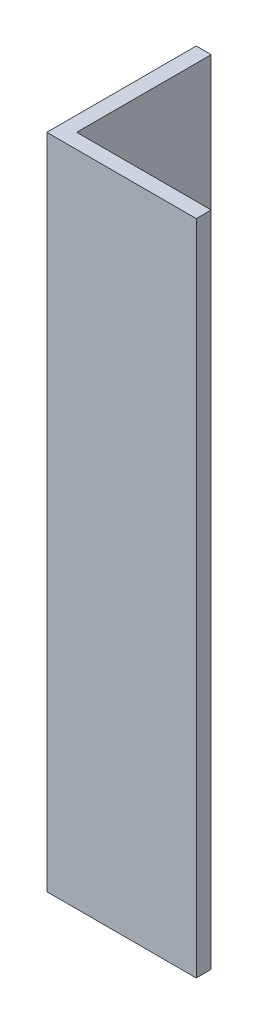
ISO-10303-21;
HEADER;
FILE_DESCRIPTION(('STEP AP214'),'2;1');
FILE_NAME('part.step','',(''),(''),'','','');
FILE_SCHEMA(('AUTOMOTIVE_DESIGN { 1 0 10303 214 1 1 1 1 }'));
ENDSEC;
DATA;
#1=APPLICATION_CONTEXT('core data for automotive mechanical design processes');
#2=APPLICATION_PROTOCOL_DEFINITION('international standard','automotive_design',2000,#1);
#3=PRODUCT_CONTEXT('',#1,'mechanical');
#4=PRODUCT('Part','Part','',(#3));
#5=PRODUCT_RELATED_PRODUCT_CATEGORY('part','',(#4));
#6=PRODUCT_DEFINITION_FORMATION('','',#4);
#7=PRODUCT_DEFINITION_CONTEXT('part definition',#1,'design');
#8=PRODUCT_DEFINITION('design','',#6,#7);
#9=PRODUCT_DEFINITION_SHAPE('','',#8);
#10=(LENGTH_UNIT() NAMED_UNIT(*) SI_UNIT(.MILLI.,.METRE.));
#11=(NAMED_UNIT(*) PLANE_ANGLE_UNIT() SI_UNIT($,.RADIAN.));
#12=(NAMED_UNIT(*) SI_UNIT($,.STERADIAN.) SOLID_ANGLE_UNIT());
#13=UNCERTAINTY_MEASURE_WITH_UNIT(LENGTH_MEASURE(1.E-05),#10,'distance_accuracy_value','');
#14=(GEOMETRIC_REPRESENTATION_CONTEXT(3) GLOBAL_UNCERTAINTY_ASSIGNED_CONTEXT((#13)) GLOBAL_UNIT_ASSIGNED_CONTEXT((#10,
#11,#12)) REPRESENTATION_CONTEXT('',''));
#15=CARTESIAN_POINT('',(0.,0.,0.));
#16=DIRECTION('',(0.,0.,1.));
#17=DIRECTION('',(1.,0.,0.));
#18=AXIS2_PLACEMENT_3D('',#15,#16,#17);
#19=CARTESIAN_POINT('',(0.,-44.,0.));
#20=DIRECTION('',(-1.,0.,0.));
#21=DIRECTION('',(0.,0.,1.));
#22=AXIS2_PLACEMENT_3D('',#19,#20,#21);
#23=PLANE('',#22);
#24=DIRECTION('',(0.,1.,0.));
#25=VECTOR('',#24,1.);
#26=CARTESIAN_POINT('',(0.,-44.,0.));
#27=LINE('',#26,#25);
#28=CARTESIAN_POINT('',(0.,-44.,0.));
#29=VERTEX_POINT('',#28);
#30=CARTESIAN_POINT('',(0.,44.,0.));
#31=VERTEX_POINT('',#30);
#32=EDGE_CURVE('E44',#29,#31,#27,.T.);
#33=ORIENTED_EDGE('',*,*,#32,.T.);
#34=DIRECTION('',(0.,0.,1.));
#35=VECTOR('',#34,1.);
#36=CARTESIAN_POINT('',(0.,44.,0.));
#37=LINE('',#36,#35);
#38=CARTESIAN_POINT('',(0.,44.,-20.));
#39=VERTEX_POINT('',#38);
#40=EDGE_CURVE('E94',#39,#31,#37,.T.);
#41=ORIENTED_EDGE('',*,*,#40,.F.);
#42=DIRECTION('',(0.,1.,0.));
#43=VECTOR('',#42,1.);
#44=CARTESIAN_POINT('',(0.,-44.,-20.));
#45=LINE('',#44,#43);
#46=CARTESIAN_POINT('',(0.,-44.,-20.));
#47=VERTEX_POINT('',#46);
#48=EDGE_CURVE('E11',#47,#39,#45,.T.);
#49=ORIENTED_EDGE('',*,*,#48,.F.);
#50=DIRECTION('',(0.,0.,1.));
#51=VECTOR('',#50,1.);
#52=CARTESIAN_POINT('',(0.,-44.,0.));
#53=LINE('',#52,#51);
#54=EDGE_CURVE('E95',#47,#29,#53,.T.);
#55=ORIENTED_EDGE('',*,*,#54,.T.);
#56=EDGE_LOOP('',(#33,#41,#49,#55));
#57=FACE_BOUND('',#56,.T.);
#58=ADVANCED_FACE('F41',(#57),#23,.T.);
#59=CARTESIAN_POINT('',(0.,-44.,-20.));
#60=DIRECTION('',(0.,0.,-1.));
#61=DIRECTION('',(-1.,0.,0.));
#62=AXIS2_PLACEMENT_3D('',#59,#60,#61);
#63=PLANE('',#62);
#64=ORIENTED_EDGE('',*,*,#48,.T.);
#65=DIRECTION('',(-1.,0.,0.));
#66=VECTOR('',#65,1.);
#67=CARTESIAN_POINT('',(0.,44.,-20.));
#68=LINE('',#67,#66);
#69=CARTESIAN_POINT('',(2.,44.,-20.));
#70=VERTEX_POINT('',#69);
#71=EDGE_CURVE('E114',#70,#39,#68,.T.);
#72=ORIENTED_EDGE('',*,*,#71,.F.);
#73=DIRECTION('',(0.,1.,0.));
#74=VECTOR('',#73,1.);
#75=CARTESIAN_POINT('',(2.,-44.,-20.));
#76=LINE('',#75,#74);
#77=CARTESIAN_POINT('',(2.,-44.,-20.));
#78=VERTEX_POINT('',#77);
#79=EDGE_CURVE('E50',#78,#70,#76,.T.);
#80=ORIENTED_EDGE('',*,*,#79,.F.);
#81=DIRECTION('',(-1.,0.,0.));
#82=VECTOR('',#81,1.);
#83=CARTESIAN_POINT('',(0.,-44.,-20.));
#84=LINE('',#83,#82);
#85=EDGE_CURVE('E101',#78,#47,#84,.T.);
#86=ORIENTED_EDGE('',*,*,#85,.T.);
#87=EDGE_LOOP('',(#64,#72,#80,#86));
#88=FACE_BOUND('',#87,.T.);
#89=ADVANCED_FACE('F169',(#88),#63,.T.);
#90=CARTESIAN_POINT('',(2.,-44.,-20.));
#91=DIRECTION('',(1.,0.,0.));
#92=DIRECTION('',(0.,0.,-1.));
#93=AXIS2_PLACEMENT_3D('',#90,#91,#92);
#94=PLANE('',#93);
#95=ORIENTED_EDGE('',*,*,#79,.T.);
#96=DIRECTION('',(0.,0.,-1.));
#97=VECTOR('',#96,1.);
#98=CARTESIAN_POINT('',(2.,44.,-20.));
#99=LINE('',#98,#97);
#100=CARTESIAN_POINT('',(2.,44.,-2.));
#101=VERTEX_POINT('',#100);
#102=EDGE_CURVE('E124',#101,#70,#99,.T.);
#103=ORIENTED_EDGE('',*,*,#102,.F.);
#104=DIRECTION('',(0.,1.,0.));
#105=VECTOR('',#104,1.);
#106=CARTESIAN_POINT('',(2.,-44.,-2.));
#107=LINE('',#106,#105);
#108=CARTESIAN_POINT('',(2.,-44.,-2.));
#109=VERTEX_POINT('',#108);
#110=EDGE_CURVE('E149',#109,#101,#107,.T.);
#111=ORIENTED_EDGE('',*,*,#110,.F.);
#112=DIRECTION('',(0.,0.,-1.));
#113=VECTOR('',#112,1.);
#114=CARTESIAN_POINT('',(2.,-44.,-20.));
#115=LINE('',#114,#113);
#116=EDGE_CURVE('E142',#109,#78,#115,.T.);
#117=ORIENTED_EDGE('',*,*,#116,.T.);
#118=EDGE_LOOP('',(#95,#103,#111,#117));
#119=FACE_BOUND('',#118,.T.);
#120=ADVANCED_FACE('F165',(#119),#94,.T.);
#121=CARTESIAN_POINT('',(20.,-44.,-2.));
#122=DIRECTION('',(0.,0.,-1.));
#123=DIRECTION('',(-1.,0.,0.));
#124=AXIS2_PLACEMENT_3D('',#121,#122,#123);
#125=PLANE('',#124);
#126=ORIENTED_EDGE('',*,*,#110,.T.);
#127=DIRECTION('',(-1.,0.,0.));
#128=VECTOR('',#127,1.);
#129=CARTESIAN_POINT('',(20.,44.,-2.));
#130=LINE('',#129,#128);
#131=CARTESIAN_POINT('',(20.,44.,-2.));
#132=VERTEX_POINT('',#131);
#133=EDGE_CURVE('E120',#132,#101,#130,.T.);
#134=ORIENTED_EDGE('',*,*,#133,.F.);
#135=DIRECTION('',(0.,1.,0.));
#136=VECTOR('',#135,1.);
#137=CARTESIAN_POINT('',(20.,-44.,-2.));
#138=LINE('',#137,#136);
#139=CARTESIAN_POINT('',(20.,-44.,-2.));
#140=VERTEX_POINT('',#139);
#141=EDGE_CURVE('E152',#140,#132,#138,.T.);
#142=ORIENTED_EDGE('',*,*,#141,.F.);
#143=DIRECTION('',(-1.,0.,0.));
#144=VECTOR('',#143,1.);
#145=CARTESIAN_POINT('',(20.,-44.,-2.));
#146=LINE('',#145,#144);
#147=EDGE_CURVE('E138',#140,#109,#146,.T.);
#148=ORIENTED_EDGE('',*,*,#147,.T.);
#149=EDGE_LOOP('',(#126,#134,#142,#148));
#150=FACE_BOUND('',#149,.T.);
#151=ADVANCED_FACE('F162',(#150),#125,.T.);
#152=CARTESIAN_POINT('',(20.,-44.,0.));
#153=DIRECTION('',(1.,0.,0.));
#154=DIRECTION('',(0.,0.,-1.));
#155=AXIS2_PLACEMENT_3D('',#152,#153,#154);
#156=PLANE('',#155);
#157=ORIENTED_EDGE('',*,*,#141,.T.);
#158=DIRECTION('',(0.,0.,-1.));
#159=VECTOR('',#158,1.);
#160=CARTESIAN_POINT('',(20.,44.,0.));
#161=LINE('',#160,#159);
#162=CARTESIAN_POINT('',(20.,44.,0.));
#163=VERTEX_POINT('',#162);
#164=EDGE_CURVE('E109',#163,#132,#161,.T.);
#165=ORIENTED_EDGE('',*,*,#164,.F.);
#166=DIRECTION('',(0.,1.,0.));
#167=VECTOR('',#166,1.);
#168=CARTESIAN_POINT('',(20.,-44.,0.));
#169=LINE('',#168,#167);
#170=CARTESIAN_POINT('',(20.,-44.,0.));
#171=VERTEX_POINT('',#170);
#172=EDGE_CURVE('E100',#171,#163,#169,.T.);
#173=ORIENTED_EDGE('',*,*,#172,.F.);
#174=DIRECTION('',(0.,0.,-1.));
#175=VECTOR('',#174,1.);
#176=CARTESIAN_POINT('',(20.,-44.,0.));
#177=LINE('',#176,#175);
#178=EDGE_CURVE('E134',#171,#140,#177,.T.);
#179=ORIENTED_EDGE('',*,*,#178,.T.);
#180=EDGE_LOOP('',(#157,#165,#173,#179));
#181=FACE_BOUND('',#180,.T.);
#182=ADVANCED_FACE('F156',(#181),#156,.T.);
#183=CARTESIAN_POINT('',(0.,-44.,0.));
#184=DIRECTION('',(0.,0.,1.));
#185=DIRECTION('',(1.,0.,0.));
#186=AXIS2_PLACEMENT_3D('',#183,#184,#185);
#187=PLANE('',#186);
#188=ORIENTED_EDGE('',*,*,#172,.T.);
#189=DIRECTION('',(1.,0.,0.));
#190=VECTOR('',#189,1.);
#191=CARTESIAN_POINT('',(0.,44.,0.));
#192=LINE('',#191,#190);
#193=EDGE_CURVE('E103',#31,#163,#192,.T.);
#194=ORIENTED_EDGE('',*,*,#193,.F.);
#195=ORIENTED_EDGE('',*,*,#32,.F.);
#196=DIRECTION('',(1.,0.,0.));
#197=VECTOR('',#196,1.);
#198=CARTESIAN_POINT('',(0.,-44.,0.));
#199=LINE('',#198,#197);
#200=EDGE_CURVE('E131',#29,#171,#199,.T.);
#201=ORIENTED_EDGE('',*,*,#200,.T.);
#202=EDGE_LOOP('',(#188,#194,#195,#201));
#203=FACE_BOUND('',#202,.T.);
#204=ADVANCED_FACE('F104',(#203),#187,.T.);
#205=CARTESIAN_POINT('',(0.,-44.,0.));
#206=DIRECTION('',(0.,-1.,0.));
#207=DIRECTION('',(0.,0.,-1.));
#208=AXIS2_PLACEMENT_3D('',#205,#206,#207);
#209=PLANE('',#208);
#210=ORIENTED_EDGE('',*,*,#54,.F.);
#211=ORIENTED_EDGE('',*,*,#85,.F.);
#212=ORIENTED_EDGE('',*,*,#116,.F.);
#213=ORIENTED_EDGE('',*,*,#147,.F.);
#214=ORIENTED_EDGE('',*,*,#178,.F.);
#215=ORIENTED_EDGE('',*,*,#200,.F.);
#216=EDGE_LOOP('',(#210,#211,#212,#213,#214,#215));
#217=FACE_BOUND('',#216,.T.);
#218=ADVANCED_FACE('F168',(#217),#209,.T.);
#219=CARTESIAN_POINT('',(0.,44.,0.));
#220=DIRECTION('',(0.,-1.,0.));
#221=DIRECTION('',(0.,0.,-1.));
#222=AXIS2_PLACEMENT_3D('',#219,#220,#221);
#223=PLANE('',#222);
#224=ORIENTED_EDGE('',*,*,#40,.T.);
#225=ORIENTED_EDGE('',*,*,#193,.T.);
#226=ORIENTED_EDGE('',*,*,#164,.T.);
#227=ORIENTED_EDGE('',*,*,#133,.T.);
#228=ORIENTED_EDGE('',*,*,#102,.T.);
#229=ORIENTED_EDGE('',*,*,#71,.T.);
#230=EDGE_LOOP('',(#224,#225,#226,#227,#228,#229));
#231=FACE_BOUND('',#230,.T.);
#232=ADVANCED_FACE('F112',(#231),#223,.F.);
#233=CLOSED_SHELL('',(#58,#89,#120,#151,#182,#204,#218,#232));
#234=MANIFOLD_SOLID_BREP('B2',#233);
#235=ADVANCED_BREP_SHAPE_REPRESENTATION('',(#18,#234),#14);
#236=SHAPE_DEFINITION_REPRESENTATION(#9,#235);
ENDSEC;
END-ISO-10303-21;
